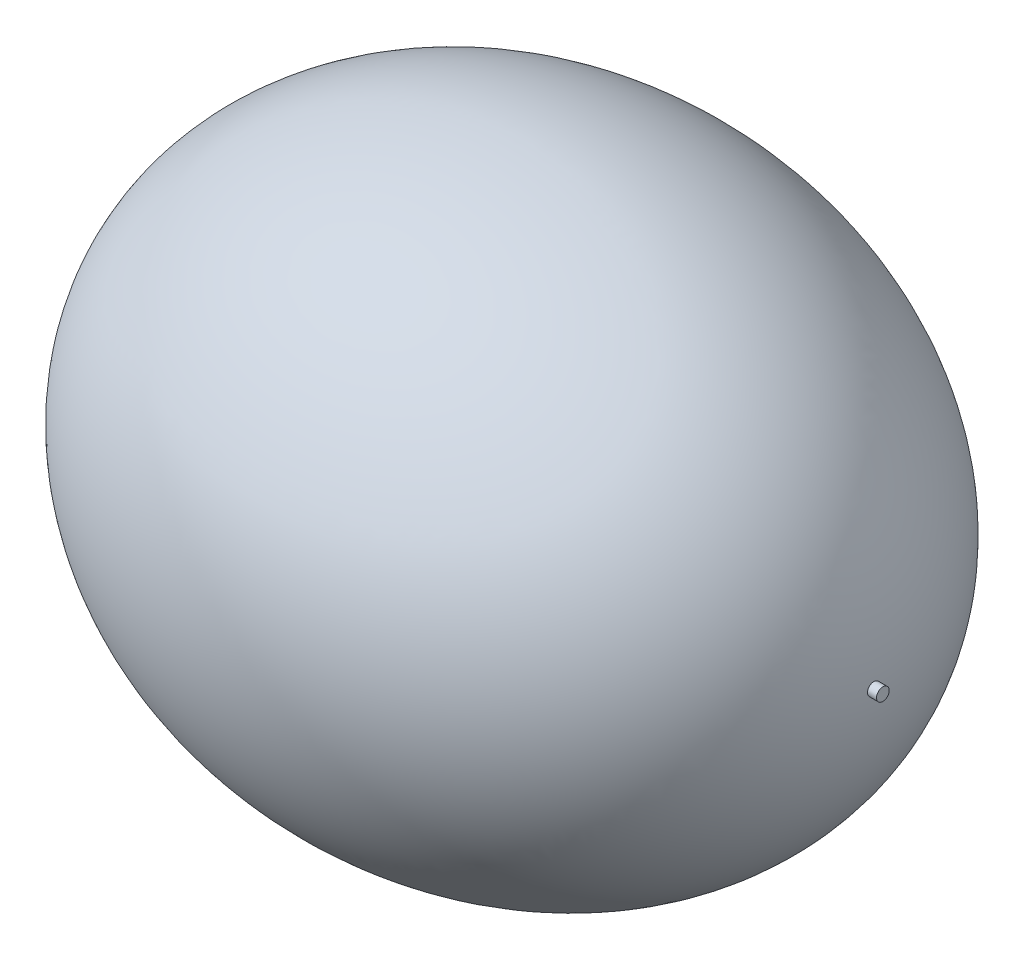
ISO-10303-21;
HEADER;
FILE_DESCRIPTION(('STEP AP214'),'2;1');
FILE_NAME('part.step','',(''),(''),'','','');
FILE_SCHEMA(('AUTOMOTIVE_DESIGN { 1 0 10303 214 1 1 1 1 }'));
ENDSEC;
DATA;
#1=APPLICATION_CONTEXT('core data for automotive mechanical design processes');
#2=APPLICATION_PROTOCOL_DEFINITION('international standard','automotive_design',2000,#1);
#3=PRODUCT_CONTEXT('',#1,'mechanical');
#4=PRODUCT('Part','Part','',(#3));
#5=PRODUCT_RELATED_PRODUCT_CATEGORY('part','',(#4));
#6=PRODUCT_DEFINITION_FORMATION('','',#4);
#7=PRODUCT_DEFINITION_CONTEXT('part definition',#1,'design');
#8=PRODUCT_DEFINITION('design','',#6,#7);
#9=PRODUCT_DEFINITION_SHAPE('','',#8);
#10=(LENGTH_UNIT() NAMED_UNIT(*) SI_UNIT(.MILLI.,.METRE.));
#11=(NAMED_UNIT(*) PLANE_ANGLE_UNIT() SI_UNIT($,.RADIAN.));
#12=(NAMED_UNIT(*) SI_UNIT($,.STERADIAN.) SOLID_ANGLE_UNIT());
#13=UNCERTAINTY_MEASURE_WITH_UNIT(LENGTH_MEASURE(1.E-05),#10,'distance_accuracy_value','');
#14=(GEOMETRIC_REPRESENTATION_CONTEXT(3) GLOBAL_UNCERTAINTY_ASSIGNED_CONTEXT((#13)) GLOBAL_UNIT_ASSIGNED_CONTEXT((#10,
#11,#12)) REPRESENTATION_CONTEXT('',''));
#15=CARTESIAN_POINT('',(0.,0.,0.));
#16=DIRECTION('',(0.,0.,1.));
#17=DIRECTION('',(1.,0.,0.));
#18=AXIS2_PLACEMENT_3D('',#15,#16,#17);
#19=CARTESIAN_POINT('',(399.969702994626,7.,0.));
#20=DIRECTION('',(1.,0.,0.));
#21=DIRECTION('',(0.,0.,-1.));
#22=AXIS2_PLACEMENT_3D('',#19,#20,#21);
#23=PLANE('',#22);
#24=CARTESIAN_POINT('',(399.969702994626,0.,0.));
#25=DIRECTION('',(-1.,0.,0.));
#26=DIRECTION('',(0.,0.,1.));
#27=AXIS2_PLACEMENT_3D('',#24,#25,#26);
#28=CIRCLE('',#27,7.);
#29=CARTESIAN_POINT('',(399.969702994626,0.,7.));
#30=VERTEX_POINT('',#29);
#31=EDGE_CURVE('E59',#30,#30,#28,.T.);
#32=ORIENTED_EDGE('',*,*,#31,.T.);
#33=EDGE_LOOP('',(#32));
#34=FACE_BOUND('',#33,.T.);
#35=ADVANCED_FACE('F53',(#34),#23,.F.);
#36=CARTESIAN_POINT('',(409.969702994626,0.,0.));
#37=DIRECTION('',(-1.,0.,0.));
#38=DIRECTION('',(0.,0.,1.));
#39=AXIS2_PLACEMENT_3D('',#36,#37,#38);
#40=PLANE('',#39);
#41=CARTESIAN_POINT('',(409.969702994626,0.,0.));
#42=DIRECTION('',(-1.,0.,0.));
#43=DIRECTION('',(0.,0.,1.));
#44=AXIS2_PLACEMENT_3D('',#41,#42,#43);
#45=CIRCLE('',#44,7.);
#46=CARTESIAN_POINT('',(409.969702994626,0.,7.));
#47=VERTEX_POINT('',#46);
#48=EDGE_CURVE('E11',#47,#47,#45,.T.);
#49=ORIENTED_EDGE('',*,*,#48,.F.);
#50=EDGE_LOOP('',(#49));
#51=FACE_BOUND('',#50,.T.);
#52=ADVANCED_FACE('F68',(#51),#40,.F.);
#53=CARTESIAN_POINT('',(399.969702994626,0.,0.));
#54=DIRECTION('',(-1.,0.,0.));
#55=DIRECTION('',(0.,0.,1.));
#56=AXIS2_PLACEMENT_3D('',#53,#54,#55);
#57=CYLINDRICAL_SURFACE('',#56,7.);
#58=ORIENTED_EDGE('',*,*,#31,.F.);
#59=EDGE_LOOP('',(#58));
#60=FACE_BOUND('',#59,.T.);
#61=ORIENTED_EDGE('',*,*,#48,.T.);
#62=EDGE_LOOP('',(#61));
#63=FACE_BOUND('',#62,.T.);
#64=ADVANCED_FACE('F66',(#60,#63),#57,.T.);
#65=CLOSED_SHELL('',(#35,#52,#64));
#66=MANIFOLD_SOLID_BREP('B2',#65);
#67=CARTESIAN_POINT('',(0.,0.,0.));
#68=DIRECTION('',(1.,0.,0.));
#69=DIRECTION('',(0.,0.,-1.));
#70=AXIS2_PLACEMENT_3D('',#67,#68,#69);
#71=CYLINDRICAL_SURFACE('',#70,3.99999999999995);
#72=CARTESIAN_POINT('',(399.969702994626,0.,0.));
#73=DIRECTION('',(1.,0.,0.));
#74=DIRECTION('',(0.,0.,-1.));
#75=AXIS2_PLACEMENT_3D('',#72,#73,#74);
#76=CIRCLE('',#75,3.99999999999995);
#77=CARTESIAN_POINT('',(399.969702994626,0.,-4.));
#78=VERTEX_POINT('',#77);
#79=EDGE_CURVE('E51',#78,#78,#76,.T.);
#80=ORIENTED_EDGE('',*,*,#79,.T.);
#81=EDGE_LOOP('',(#80));
#82=FACE_BOUND('',#81,.T.);
#83=CARTESIAN_POINT('',(399.41690912469,0.,0.));
#84=DIRECTION('',(1.,0.,0.));
#85=DIRECTION('',(0.,0.,-1.));
#86=AXIS2_PLACEMENT_3D('',#83,#84,#85);
#87=CIRCLE('',#86,3.99999999999995);
#88=CARTESIAN_POINT('',(399.41690912469,0.,-4.));
#89=VERTEX_POINT('',#88);
#90=EDGE_CURVE('E101',#89,#89,#87,.T.);
#91=ORIENTED_EDGE('',*,*,#90,.F.);
#92=EDGE_LOOP('',(#91));
#93=FACE_BOUND('',#92,.T.);
#94=ADVANCED_FACE('F94',(#82,#93),#71,.F.);
#95=CARTESIAN_POINT('',(0.,0.,0.));
#96=DIRECTION('',(0.,1.,0.));
#97=DIRECTION('',(-1.,0.,0.));
#98=AXIS2_PLACEMENT_3D('',#95,#96,#97);
#99=ELLIPSE('',#98,400.,325.);
#100=TRIMMED_CURVE('',#99,(PARAMETER_VALUE(3.14159265358979)),
(PARAMETER_VALUE(6.28318530717959)),.T.,.PARAMETER.);
#101=CARTESIAN_POINT('',(0.,0.,0.));
#102=DIRECTION('',(1.,0.,0.));
#103=AXIS1_PLACEMENT('',#101,#102);
#104=SURFACE_OF_REVOLUTION('',#100,#103);
#105=CARTESIAN_POINT('',(-400.,0.,0.));
#106=VERTEX_POINT('',#105);
#107=VERTEX_LOOP('',#106);
#108=FACE_BOUND('',#107,.T.);
#109=ORIENTED_EDGE('',*,*,#79,.F.);
#110=EDGE_LOOP('',(#109));
#111=FACE_BOUND('',#110,.T.);
#112=ADVANCED_FACE('F104',(#108,#111),#104,.F.);
#113=CARTESIAN_POINT('',(399.41690912469,0.,0.));
#114=DIRECTION('',(1.,0.,0.));
#115=DIRECTION('',(0.,0.,-1.));
#116=AXIS2_PLACEMENT_3D('',#113,#114,#115);
#117=PLANE('',#116);
#118=ORIENTED_EDGE('',*,*,#90,.T.);
#119=EDGE_LOOP('',(#118));
#120=FACE_BOUND('',#119,.T.);
#121=ADVANCED_FACE('F107',(#120),#117,.T.);
#122=CLOSED_SHELL('',(#94,#112,#121));
#123=MANIFOLD_SOLID_BREP('B6',#122);
#124=ADVANCED_BREP_SHAPE_REPRESENTATION('',(#18,#66,#123),#14);
#125=SHAPE_DEFINITION_REPRESENTATION(#9,#124);
ENDSEC;
END-ISO-10303-21;
